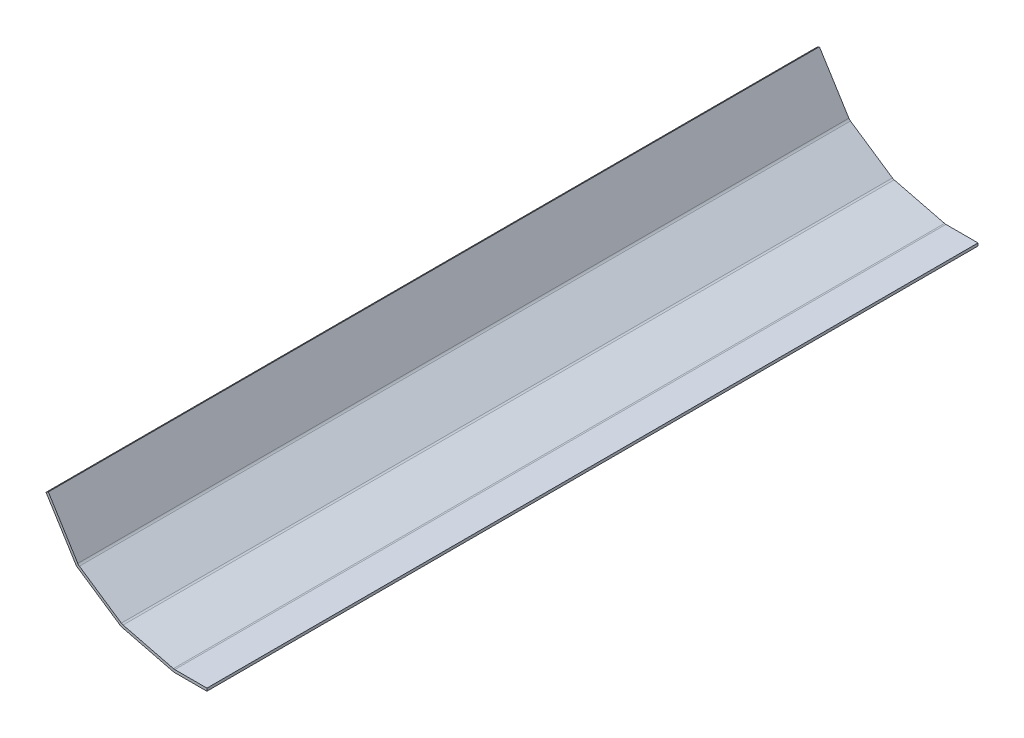
ISO-10303-21;
HEADER;
FILE_DESCRIPTION(('STEP AP214'),'2;1');
FILE_NAME('part.step','',(''),(''),'','','');
FILE_SCHEMA(('AUTOMOTIVE_DESIGN { 1 0 10303 214 1 1 1 1 }'));
ENDSEC;
DATA;
#1=APPLICATION_CONTEXT('core data for automotive mechanical design processes');
#2=APPLICATION_PROTOCOL_DEFINITION('international standard','automotive_design',2000,#1);
#3=PRODUCT_CONTEXT('',#1,'mechanical');
#4=PRODUCT('Part','Part','',(#3));
#5=PRODUCT_RELATED_PRODUCT_CATEGORY('part','',(#4));
#6=PRODUCT_DEFINITION_FORMATION('','',#4);
#7=PRODUCT_DEFINITION_CONTEXT('part definition',#1,'design');
#8=PRODUCT_DEFINITION('design','',#6,#7);
#9=PRODUCT_DEFINITION_SHAPE('','',#8);
#10=(LENGTH_UNIT() NAMED_UNIT(*) SI_UNIT(.MILLI.,.METRE.));
#11=(NAMED_UNIT(*) PLANE_ANGLE_UNIT() SI_UNIT($,.RADIAN.));
#12=(NAMED_UNIT(*) SI_UNIT($,.STERADIAN.) SOLID_ANGLE_UNIT());
#13=UNCERTAINTY_MEASURE_WITH_UNIT(LENGTH_MEASURE(1.E-05),#10,'distance_accuracy_value','');
#14=(GEOMETRIC_REPRESENTATION_CONTEXT(3) GLOBAL_UNCERTAINTY_ASSIGNED_CONTEXT((#13)) GLOBAL_UNIT_ASSIGNED_CONTEXT((#10,
#11,#12)) REPRESENTATION_CONTEXT('',''));
#15=CARTESIAN_POINT('',(0.,0.,0.));
#16=DIRECTION('',(0.,0.,1.));
#17=DIRECTION('',(1.,0.,0.));
#18=AXIS2_PLACEMENT_3D('',#15,#16,#17);
#19=CARTESIAN_POINT('',(151.999999999742,1.9999999994139,282.));
#20=DIRECTION('',(-1.,0.,0.));
#21=DIRECTION('',(0.,0.,1.));
#22=AXIS2_PLACEMENT_3D('',#19,#20,#21);
#23=PLANE('',#22);
#24=DIRECTION('',(0.,1.,0.));
#25=VECTOR('',#24,1.);
#26=CARTESIAN_POINT('',(151.999999999742,1.9999999994139,0.));
#27=LINE('',#26,#25);
#28=CARTESIAN_POINT('',(151.999999999742,1.9999999994139,0.));
#29=VERTEX_POINT('',#28);
#30=CARTESIAN_POINT('',(151.999999999742,2.9999999996182,0.));
#31=VERTEX_POINT('',#30);
#32=EDGE_CURVE('E183',#29,#31,#27,.T.);
#33=ORIENTED_EDGE('',*,*,#32,.T.);
#34=DIRECTION('',(0.,0.,-1.));
#35=VECTOR('',#34,1.);
#36=CARTESIAN_POINT('',(151.999999999742,2.9999999996182,282.));
#37=LINE('',#36,#35);
#38=CARTESIAN_POINT('',(151.999999999742,2.9999999996182,282.));
#39=VERTEX_POINT('',#38);
#40=EDGE_CURVE('E11',#39,#31,#37,.T.);
#41=ORIENTED_EDGE('',*,*,#40,.F.);
#42=DIRECTION('',(0.,1.,0.));
#43=VECTOR('',#42,1.);
#44=CARTESIAN_POINT('',(151.999999999742,1.9999999994139,282.));
#45=LINE('',#44,#43);
#46=CARTESIAN_POINT('',(151.999999999742,1.9999999994139,282.));
#47=VERTEX_POINT('',#46);
#48=EDGE_CURVE('E213',#47,#39,#45,.T.);
#49=ORIENTED_EDGE('',*,*,#48,.F.);
#50=DIRECTION('',(0.,0.,-1.));
#51=VECTOR('',#50,1.);
#52=CARTESIAN_POINT('',(151.999999999742,1.9999999994139,282.));
#53=LINE('',#52,#51);
#54=EDGE_CURVE('E179',#47,#29,#53,.T.);
#55=ORIENTED_EDGE('',*,*,#54,.T.);
#56=EDGE_LOOP('',(#33,#41,#49,#55));
#57=FACE_BOUND('',#56,.T.);
#58=ADVANCED_FACE('F39',(#57),#23,.F.);
#59=CARTESIAN_POINT('',(151.999999999742,2.9999999996182,282.));
#60=DIRECTION('',(0.,-1.,0.));
#61=DIRECTION('',(0.,0.,-1.));
#62=AXIS2_PLACEMENT_3D('',#59,#60,#61);
#63=PLANE('',#62);
#64=DIRECTION('',(-1.,0.,0.));
#65=VECTOR('',#64,1.);
#66=CARTESIAN_POINT('',(151.999999999742,2.9999999996182,0.));
#67=LINE('',#66,#65);
#68=CARTESIAN_POINT('',(140.245569121742,2.9999999996182,0.));
#69=VERTEX_POINT('',#68);
#70=EDGE_CURVE('E186',#31,#69,#67,.T.);
#71=ORIENTED_EDGE('',*,*,#70,.T.);
#72=DIRECTION('',(0.,0.,-1.));
#73=VECTOR('',#72,1.);
#74=CARTESIAN_POINT('',(140.245569121742,2.9999999996182,282.));
#75=LINE('',#74,#73);
#76=CARTESIAN_POINT('',(140.245569121742,2.9999999996182,282.));
#77=VERTEX_POINT('',#76);
#78=EDGE_CURVE('E47',#77,#69,#75,.T.);
#79=ORIENTED_EDGE('',*,*,#78,.F.);
#80=DIRECTION('',(-1.,0.,0.));
#81=VECTOR('',#80,1.);
#82=CARTESIAN_POINT('',(151.999999999742,2.9999999996182,282.));
#83=LINE('',#82,#81);
#84=EDGE_CURVE('E122',#39,#77,#83,.T.);
#85=ORIENTED_EDGE('',*,*,#84,.F.);
#86=ORIENTED_EDGE('',*,*,#40,.T.);
#87=EDGE_LOOP('',(#71,#79,#85,#86));
#88=FACE_BOUND('',#87,.T.);
#89=ADVANCED_FACE('F311',(#88),#63,.F.);
#90=CARTESIAN_POINT('',(140.245569127537,5.00000005981967,282.));
#91=DIRECTION('',(0.,0.,-1.));
#92=DIRECTION('',(-1.,0.,0.));
#93=AXIS2_PLACEMENT_3D('',#90,#91,#92);
#94=CYLINDRICAL_SURFACE('',#93,2.00000006020147);
#95=CARTESIAN_POINT('',(140.245569127537,5.00000005981967,0.));
#96=DIRECTION('',(0.,0.,-1.));
#97=DIRECTION('',(-1.,0.,0.));
#98=AXIS2_PLACEMENT_3D('',#95,#96,#97);
#99=CIRCLE('',#98,2.00000006020147);
#100=CARTESIAN_POINT('',(139.761725330742,3.05940854661819,0.));
#101=VERTEX_POINT('',#100);
#102=EDGE_CURVE('E188',#69,#101,#99,.T.);
#103=ORIENTED_EDGE('',*,*,#102,.T.);
#104=DIRECTION('',(0.,0.,-1.));
#105=VECTOR('',#104,1.);
#106=CARTESIAN_POINT('',(139.761725330742,3.05940854661819,282.));
#107=LINE('',#106,#105);
#108=CARTESIAN_POINT('',(139.761725330742,3.05940854661819,282.));
#109=VERTEX_POINT('',#108);
#110=EDGE_CURVE('E244',#109,#101,#107,.T.);
#111=ORIENTED_EDGE('',*,*,#110,.F.);
#112=CARTESIAN_POINT('',(140.245569127537,5.00000005981967,282.));
#113=DIRECTION('',(0.,0.,-1.));
#114=DIRECTION('',(-1.,0.,0.));
#115=AXIS2_PLACEMENT_3D('',#112,#113,#114);
#116=CIRCLE('',#115,2.00000006020147);
#117=EDGE_CURVE('E252',#77,#109,#116,.T.);
#118=ORIENTED_EDGE('',*,*,#117,.F.);
#119=ORIENTED_EDGE('',*,*,#78,.T.);
#120=EDGE_LOOP('',(#103,#111,#118,#119));
#121=FACE_BOUND('',#120,.T.);
#122=ADVANCED_FACE('F250',(#121),#94,.F.);
#123=CARTESIAN_POINT('',(139.761725330742,3.0594085466182,282.));
#124=DIRECTION('',(-0.241921895612643,-0.970295726272761,0.));
#125=DIRECTION('',(0.970295726272761,-0.241921895612643,0.));
#126=AXIS2_PLACEMENT_3D('',#123,#124,#125);
#127=PLANE('',#126);
#128=DIRECTION('',(-0.970295726272761,0.241921895612643,0.));
#129=VECTOR('',#128,1.);
#130=CARTESIAN_POINT('',(139.761725330742,3.0594085466182,0.));
#131=LINE('',#130,#129);
#132=CARTESIAN_POINT('',(121.342178631742,7.6519173386182,0.));
#133=VERTEX_POINT('',#132);
#134=EDGE_CURVE('E190',#101,#133,#131,.T.);
#135=ORIENTED_EDGE('',*,*,#134,.T.);
#136=DIRECTION('',(0.,0.,-1.));
#137=VECTOR('',#136,1.);
#138=CARTESIAN_POINT('',(121.342178631742,7.6519173386182,282.));
#139=LINE('',#138,#137);
#140=CARTESIAN_POINT('',(121.342178631742,7.6519173386182,282.));
#141=VERTEX_POINT('',#140);
#142=EDGE_CURVE('E241',#141,#133,#139,.T.);
#143=ORIENTED_EDGE('',*,*,#142,.F.);
#144=DIRECTION('',(-0.970295726272761,0.241921895612643,0.));
#145=VECTOR('',#144,1.);
#146=CARTESIAN_POINT('',(139.761725330742,3.0594085466182,282.));
#147=LINE('',#146,#145);
#148=EDGE_CURVE('E270',#109,#141,#147,.T.);
#149=ORIENTED_EDGE('',*,*,#148,.F.);
#150=ORIENTED_EDGE('',*,*,#110,.T.);
#151=EDGE_LOOP('',(#135,#143,#149,#150));
#152=FACE_BOUND('',#151,.T.);
#153=ADVANCED_FACE('F261',(#152),#127,.F.);
#154=CARTESIAN_POINT('',(121.826022412471,9.59250876539766,282.));
#155=DIRECTION('',(0.,0.,-1.));
#156=DIRECTION('',(-1.,0.,0.));
#157=AXIS2_PLACEMENT_3D('',#154,#155,#156);
#158=CYLINDRICAL_SURFACE('',#157,1.99999997245991);
#159=CARTESIAN_POINT('',(121.826022412471,9.59250876539766,0.));
#160=DIRECTION('',(0.,0.,-1.));
#161=DIRECTION('',(-1.,0.,0.));
#162=AXIS2_PLACEMENT_3D('',#159,#160,#161);
#163=CIRCLE('',#162,1.99999997245991);
#164=CARTESIAN_POINT('',(120.707636615742,7.9344336466182,0.));
#165=VERTEX_POINT('',#164);
#166=EDGE_CURVE('E192',#133,#165,#163,.T.);
#167=ORIENTED_EDGE('',*,*,#166,.T.);
#168=DIRECTION('',(0.,0.,-1.));
#169=VECTOR('',#168,1.);
#170=CARTESIAN_POINT('',(120.707636615742,7.9344336466182,282.));
#171=LINE('',#170,#169);
#172=CARTESIAN_POINT('',(120.707636615742,7.9344336466182,282.));
#173=VERTEX_POINT('',#172);
#174=EDGE_CURVE('E238',#173,#165,#171,.T.);
#175=ORIENTED_EDGE('',*,*,#174,.F.);
#176=CARTESIAN_POINT('',(121.826022412471,9.59250876539766,282.));
#177=DIRECTION('',(0.,0.,-1.));
#178=DIRECTION('',(-1.,0.,0.));
#179=AXIS2_PLACEMENT_3D('',#176,#177,#178);
#180=CIRCLE('',#179,1.99999997245991);
#181=EDGE_CURVE('E267',#141,#173,#180,.T.);
#182=ORIENTED_EDGE('',*,*,#181,.F.);
#183=ORIENTED_EDGE('',*,*,#142,.T.);
#184=EDGE_LOOP('',(#167,#175,#182,#183));
#185=FACE_BOUND('',#184,.T.);
#186=ADVANCED_FACE('F265',(#185),#158,.F.);
#187=CARTESIAN_POINT('',(120.707636615742,7.9344336466182,282.));
#188=DIRECTION('',(-0.559192903466935,-0.829037572557613,0.));
#189=DIRECTION('',(0.829037572557613,-0.559192903466935,0.));
#190=AXIS2_PLACEMENT_3D('',#187,#188,#189);
#191=PLANE('',#190);
#192=DIRECTION('',(-0.829037572557613,0.559192903466935,0.));
#193=VECTOR('',#192,1.);
#194=CARTESIAN_POINT('',(120.707636615742,7.9344336466182,0.));
#195=LINE('',#194,#193);
#196=CARTESIAN_POINT('',(105.352434751742,18.2916480816182,0.));
#197=VERTEX_POINT('',#196);
#198=EDGE_CURVE('E194',#165,#197,#195,.T.);
#199=ORIENTED_EDGE('',*,*,#198,.T.);
#200=DIRECTION('',(0.,0.,-1.));
#201=VECTOR('',#200,1.);
#202=CARTESIAN_POINT('',(105.352434751742,18.2916480816182,282.));
#203=LINE('',#202,#201);
#204=CARTESIAN_POINT('',(105.352434751742,18.2916480816182,282.));
#205=VERTEX_POINT('',#204);
#206=EDGE_CURVE('E235',#205,#197,#203,.T.);
#207=ORIENTED_EDGE('',*,*,#206,.F.);
#208=DIRECTION('',(-0.829037572557613,0.559192903466935,0.));
#209=VECTOR('',#208,1.);
#210=CARTESIAN_POINT('',(120.707636615742,7.9344336466182,282.));
#211=LINE('',#210,#209);
#212=EDGE_CURVE('E269',#173,#205,#211,.T.);
#213=ORIENTED_EDGE('',*,*,#212,.F.);
#214=ORIENTED_EDGE('',*,*,#174,.T.);
#215=EDGE_LOOP('',(#199,#207,#213,#214));
#216=FACE_BOUND('',#215,.T.);
#217=ADVANCED_FACE('F324',(#216),#191,.F.);
#218=CARTESIAN_POINT('',(106.470820560964,19.9497232318525,282.));
#219=DIRECTION('',(0.,0.,-1.));
#220=DIRECTION('',(-1.,0.,0.));
#221=AXIS2_PLACEMENT_3D('',#218,#219,#220);
#222=CYLINDRICAL_SURFACE('',#221,2.00000000552306);
#223=CARTESIAN_POINT('',(106.470820560964,19.9497232318525,0.));
#224=DIRECTION('',(0.,0.,-1.));
#225=DIRECTION('',(-1.,0.,0.));
#226=AXIS2_PLACEMENT_3D('',#223,#224,#225);
#227=CIRCLE('',#226,2.00000000552306);
#228=CARTESIAN_POINT('',(104.774724365742,18.8898846976182,0.));
#229=VERTEX_POINT('',#228);
#230=EDGE_CURVE('E196',#197,#229,#227,.T.);
#231=ORIENTED_EDGE('',*,*,#230,.T.);
#232=DIRECTION('',(0.,0.,-1.));
#233=VECTOR('',#232,1.);
#234=CARTESIAN_POINT('',(104.774724365742,18.8898846976182,282.));
#235=LINE('',#234,#233);
#236=CARTESIAN_POINT('',(104.774724365742,18.8898846976182,282.));
#237=VERTEX_POINT('',#236);
#238=EDGE_CURVE('E232',#237,#229,#235,.T.);
#239=ORIENTED_EDGE('',*,*,#238,.F.);
#240=CARTESIAN_POINT('',(106.470820560964,19.9497232318525,282.));
#241=DIRECTION('',(0.,0.,-1.));
#242=DIRECTION('',(-1.,0.,0.));
#243=AXIS2_PLACEMENT_3D('',#240,#241,#242);
#244=CIRCLE('',#243,2.00000000552306);
#245=EDGE_CURVE('E272',#205,#237,#244,.T.);
#246=ORIENTED_EDGE('',*,*,#245,.F.);
#247=ORIENTED_EDGE('',*,*,#206,.T.);
#248=EDGE_LOOP('',(#231,#239,#246,#247));
#249=FACE_BOUND('',#248,.T.);
#250=ADVANCED_FACE('F327',(#249),#222,.F.);
#251=CARTESIAN_POINT('',(104.774724365742,18.8898846976182,282.));
#252=DIRECTION('',(-0.848048096172864,-0.529919264206898,0.));
#253=DIRECTION('',(0.529919264206898,-0.848048096172864,0.));
#254=AXIS2_PLACEMENT_3D('',#251,#252,#253);
#255=PLANE('',#254);
#256=DIRECTION('',(-0.529919264206898,0.848048096172864,0.));
#257=VECTOR('',#256,1.);
#258=CARTESIAN_POINT('',(104.774724365742,18.8898846976182,0.));
#259=LINE('',#258,#257);
#260=CARTESIAN_POINT('',(93.9999999997425,36.1330481426182,0.));
#261=VERTEX_POINT('',#260);
#262=EDGE_CURVE('E198',#229,#261,#259,.T.);
#263=ORIENTED_EDGE('',*,*,#262,.T.);
#264=DIRECTION('',(0.,0.,-1.));
#265=VECTOR('',#264,1.);
#266=CARTESIAN_POINT('',(93.9999999997425,36.1330481426182,282.));
#267=LINE('',#266,#265);
#268=CARTESIAN_POINT('',(93.9999999997425,36.1330481426182,282.));
#269=VERTEX_POINT('',#268);
#270=EDGE_CURVE('E229',#269,#261,#267,.T.);
#271=ORIENTED_EDGE('',*,*,#270,.F.);
#272=DIRECTION('',(-0.529919264206898,0.848048096172864,0.));
#273=VECTOR('',#272,1.);
#274=CARTESIAN_POINT('',(104.774724365742,18.8898846976182,282.));
#275=LINE('',#274,#273);
#276=EDGE_CURVE('E278',#237,#269,#275,.T.);
#277=ORIENTED_EDGE('',*,*,#276,.F.);
#278=ORIENTED_EDGE('',*,*,#238,.T.);
#279=EDGE_LOOP('',(#263,#271,#277,#278));
#280=FACE_BOUND('',#279,.T.);
#281=ADVANCED_FACE('F331',(#280),#255,.F.);
#282=CARTESIAN_POINT('',(93.9999999997425,36.1330481426182,282.));
#283=DIRECTION('',(0.529919264135782,-0.848048096217303,0.));
#284=DIRECTION('',(0.848048096217303,0.529919264135782,0.));
#285=AXIS2_PLACEMENT_3D('',#282,#283,#284);
#286=PLANE('',#285);
#287=DIRECTION('',(-0.848048096217303,-0.529919264135782,0.));
#288=VECTOR('',#287,1.);
#289=CARTESIAN_POINT('',(93.9999999997425,36.1330481426182,0.));
#290=LINE('',#289,#288);
#291=CARTESIAN_POINT('',(93.1519519033519,35.6031288783742,0.));
#292=VERTEX_POINT('',#291);
#293=EDGE_CURVE('E200',#261,#292,#290,.T.);
#294=ORIENTED_EDGE('',*,*,#293,.T.);
#295=DIRECTION('',(0.,0.,-1.));
#296=VECTOR('',#295,1.);
#297=CARTESIAN_POINT('',(93.1519519033519,35.6031288783742,282.));
#298=LINE('',#297,#296);
#299=CARTESIAN_POINT('',(93.1519519033519,35.6031288783742,282.));
#300=VERTEX_POINT('',#299);
#301=EDGE_CURVE('E226',#300,#292,#298,.T.);
#302=ORIENTED_EDGE('',*,*,#301,.F.);
#303=DIRECTION('',(-0.848048096217303,-0.529919264135782,0.));
#304=VECTOR('',#303,1.);
#305=CARTESIAN_POINT('',(93.9999999997425,36.1330481426182,282.));
#306=LINE('',#305,#304);
#307=EDGE_CURVE('E280',#269,#300,#306,.T.);
#308=ORIENTED_EDGE('',*,*,#307,.F.);
#309=ORIENTED_EDGE('',*,*,#270,.T.);
#310=EDGE_LOOP('',(#294,#302,#308,#309));
#311=FACE_BOUND('',#310,.T.);
#312=ADVANCED_FACE('F335',(#311),#286,.F.);
#313=CARTESIAN_POINT('',(93.1519519033519,35.6031288783742,282.));
#314=DIRECTION('',(0.848048096172864,0.529919264206898,0.));
#315=DIRECTION('',(-0.529919264206898,0.848048096172865,0.));
#316=AXIS2_PLACEMENT_3D('',#313,#314,#315);
#317=PLANE('',#316);
#318=DIRECTION('',(0.529919264206898,-0.848048096172864,0.));
#319=VECTOR('',#318,1.);
#320=CARTESIAN_POINT('',(93.1519519033519,35.6031288783742,0.));
#321=LINE('',#320,#319);
#322=CARTESIAN_POINT('',(103.926676269352,18.3599654333741,0.));
#323=VERTEX_POINT('',#322);
#324=EDGE_CURVE('E202',#292,#323,#321,.T.);
#325=ORIENTED_EDGE('',*,*,#324,.T.);
#326=DIRECTION('',(0.,0.,-1.));
#327=VECTOR('',#326,1.);
#328=CARTESIAN_POINT('',(103.926676269352,18.3599654333741,282.));
#329=LINE('',#328,#327);
#330=CARTESIAN_POINT('',(103.926676269352,18.3599654333741,282.));
#331=VERTEX_POINT('',#330);
#332=EDGE_CURVE('E223',#331,#323,#329,.T.);
#333=ORIENTED_EDGE('',*,*,#332,.F.);
#334=DIRECTION('',(0.529919264206898,-0.848048096172864,0.));
#335=VECTOR('',#334,1.);
#336=CARTESIAN_POINT('',(93.1519519033519,35.6031288783742,282.));
#337=LINE('',#336,#335);
#338=EDGE_CURVE('E282',#300,#331,#337,.T.);
#339=ORIENTED_EDGE('',*,*,#338,.F.);
#340=ORIENTED_EDGE('',*,*,#301,.T.);
#341=EDGE_LOOP('',(#325,#333,#339,#340));
#342=FACE_BOUND('',#341,.T.);
#343=ADVANCED_FACE('F339',(#342),#317,.F.);
#344=CARTESIAN_POINT('',(106.470820560964,19.9497232318525,282.));
#345=DIRECTION('',(0.,0.,-1.));
#346=DIRECTION('',(-1.,0.,0.));
#347=AXIS2_PLACEMENT_3D('',#344,#345,#346);
#348=CYLINDRICAL_SURFACE('',#347,3.00000000572735);
#349=CARTESIAN_POINT('',(106.470820560964,19.9497232318525,0.));
#350=DIRECTION('',(0.,0.,1.));
#351=DIRECTION('',(1.,0.,0.));
#352=AXIS2_PLACEMENT_3D('',#349,#350,#351);
#353=CIRCLE('',#352,3.00000000572735);
#354=CARTESIAN_POINT('',(104.793241848,17.462610509,0.));
#355=VERTEX_POINT('',#354);
#356=EDGE_CURVE('E204',#323,#355,#353,.T.);
#357=ORIENTED_EDGE('',*,*,#356,.T.);
#358=DIRECTION('',(0.,0.,-1.));
#359=VECTOR('',#358,1.);
#360=CARTESIAN_POINT('',(104.793241848,17.462610509,282.));
#361=LINE('',#360,#359);
#362=CARTESIAN_POINT('',(104.793241848,17.462610509,282.));
#363=VERTEX_POINT('',#362);
#364=EDGE_CURVE('E220',#363,#355,#361,.T.);
#365=ORIENTED_EDGE('',*,*,#364,.F.);
#366=CARTESIAN_POINT('',(106.470820560964,19.9497232318525,282.));
#367=DIRECTION('',(0.,0.,1.));
#368=DIRECTION('',(1.,0.,0.));
#369=AXIS2_PLACEMENT_3D('',#366,#367,#368);
#370=CIRCLE('',#369,3.00000000572735);
#371=EDGE_CURVE('E284',#331,#363,#370,.T.);
#372=ORIENTED_EDGE('',*,*,#371,.F.);
#373=ORIENTED_EDGE('',*,*,#332,.T.);
#374=EDGE_LOOP('',(#357,#365,#372,#373));
#375=FACE_BOUND('',#374,.T.);
#376=ADVANCED_FACE('F343',(#375),#348,.T.);
#377=CARTESIAN_POINT('',(104.793241848,17.462610509,282.));
#378=DIRECTION('',(0.559192903466936,0.829037572557612,0.));
#379=DIRECTION('',(-0.829037572557612,0.559192903466936,0.));
#380=AXIS2_PLACEMENT_3D('',#377,#378,#379);
#381=PLANE('',#380);
#382=DIRECTION('',(0.829037572557612,-0.559192903466936,0.));
#383=VECTOR('',#382,1.);
#384=CARTESIAN_POINT('',(104.793241848,17.462610509,0.));
#385=LINE('',#384,#383);
#386=CARTESIAN_POINT('',(120.148443712,7.105396074,0.));
#387=VERTEX_POINT('',#386);
#388=EDGE_CURVE('E206',#355,#387,#385,.T.);
#389=ORIENTED_EDGE('',*,*,#388,.T.);
#390=DIRECTION('',(0.,0.,-1.));
#391=VECTOR('',#390,1.);
#392=CARTESIAN_POINT('',(120.148443712,7.105396074,282.));
#393=LINE('',#392,#391);
#394=CARTESIAN_POINT('',(120.148443712,7.105396074,282.));
#395=VERTEX_POINT('',#394);
#396=EDGE_CURVE('E217',#395,#387,#393,.T.);
#397=ORIENTED_EDGE('',*,*,#396,.F.);
#398=DIRECTION('',(0.829037572557612,-0.559192903466936,0.));
#399=VECTOR('',#398,1.);
#400=CARTESIAN_POINT('',(104.793241848,17.462610509,282.));
#401=LINE('',#400,#399);
#402=EDGE_CURVE('E286',#363,#395,#401,.T.);
#403=ORIENTED_EDGE('',*,*,#402,.F.);
#404=ORIENTED_EDGE('',*,*,#364,.T.);
#405=EDGE_LOOP('',(#389,#397,#403,#404));
#406=FACE_BOUND('',#405,.T.);
#407=ADVANCED_FACE('F292',(#406),#381,.F.);
#408=CARTESIAN_POINT('',(121.826022412471,9.59250876539766,282.));
#409=DIRECTION('',(0.,0.,-1.));
#410=DIRECTION('',(-1.,0.,0.));
#411=AXIS2_PLACEMENT_3D('',#408,#409,#410);
#412=CYLINDRICAL_SURFACE('',#411,2.99999997266422);
#413=CARTESIAN_POINT('',(121.826022412471,9.59250876539766,0.));
#414=DIRECTION('',(0.,0.,1.));
#415=DIRECTION('',(1.,0.,0.));
#416=AXIS2_PLACEMENT_3D('',#413,#414,#415);
#417=CIRCLE('',#416,2.99999997266422);
#418=CARTESIAN_POINT('',(121.100256735652,6.68162161225409,0.));
#419=VERTEX_POINT('',#418);
#420=EDGE_CURVE('E208',#387,#419,#417,.T.);
#421=ORIENTED_EDGE('',*,*,#420,.T.);
#422=DIRECTION('',(0.,0.,-1.));
#423=VECTOR('',#422,1.);
#424=CARTESIAN_POINT('',(121.100256735652,6.68162161225409,282.));
#425=LINE('',#424,#423);
#426=CARTESIAN_POINT('',(121.100256735652,6.68162161225409,282.));
#427=VERTEX_POINT('',#426);
#428=EDGE_CURVE('E174',#427,#419,#425,.T.);
#429=ORIENTED_EDGE('',*,*,#428,.F.);
#430=CARTESIAN_POINT('',(121.826022412471,9.59250876539766,282.));
#431=DIRECTION('',(0.,0.,1.));
#432=DIRECTION('',(1.,0.,0.));
#433=AXIS2_PLACEMENT_3D('',#430,#431,#432);
#434=CIRCLE('',#433,2.99999997266422);
#435=EDGE_CURVE('E165',#395,#427,#434,.T.);
#436=ORIENTED_EDGE('',*,*,#435,.F.);
#437=ORIENTED_EDGE('',*,*,#396,.T.);
#438=EDGE_LOOP('',(#421,#429,#436,#437));
#439=FACE_BOUND('',#438,.T.);
#440=ADVANCED_FACE('F296',(#439),#412,.T.);
#441=CARTESIAN_POINT('',(121.100256735652,6.68162161225409,282.));
#442=DIRECTION('',(0.241921895612643,0.970295726272761,0.));
#443=DIRECTION('',(-0.970295726272762,0.241921895612643,0.));
#444=AXIS2_PLACEMENT_3D('',#441,#442,#443);
#445=PLANE('',#444);
#446=DIRECTION('',(0.970295726272761,-0.241921895612643,0.));
#447=VECTOR('',#446,1.);
#448=CARTESIAN_POINT('',(121.100256735652,6.68162161225409,0.));
#449=LINE('',#448,#447);
#450=CARTESIAN_POINT('',(139.519803434652,2.08911282025409,0.));
#451=VERTEX_POINT('',#450);
#452=EDGE_CURVE('E173',#419,#451,#449,.T.);
#453=ORIENTED_EDGE('',*,*,#452,.T.);
#454=DIRECTION('',(0.,0.,-1.));
#455=VECTOR('',#454,1.);
#456=CARTESIAN_POINT('',(139.519803434652,2.08911282025409,282.));
#457=LINE('',#456,#455);
#458=CARTESIAN_POINT('',(139.519803434652,2.08911282025409,282.));
#459=VERTEX_POINT('',#458);
#460=EDGE_CURVE('E170',#459,#451,#457,.T.);
#461=ORIENTED_EDGE('',*,*,#460,.F.);
#462=DIRECTION('',(0.970295726272761,-0.241921895612643,0.));
#463=VECTOR('',#462,1.);
#464=CARTESIAN_POINT('',(121.100256735652,6.68162161225409,282.));
#465=LINE('',#464,#463);
#466=EDGE_CURVE('E159',#427,#459,#465,.T.);
#467=ORIENTED_EDGE('',*,*,#466,.F.);
#468=ORIENTED_EDGE('',*,*,#428,.T.);
#469=EDGE_LOOP('',(#453,#461,#467,#468));
#470=FACE_BOUND('',#469,.T.);
#471=ADVANCED_FACE('F171',(#470),#445,.F.);
#472=CARTESIAN_POINT('',(140.245569127537,5.00000005981967,282.));
#473=DIRECTION('',(0.,0.,-1.));
#474=DIRECTION('',(-1.,0.,0.));
#475=AXIS2_PLACEMENT_3D('',#472,#473,#474);
#476=CYLINDRICAL_SURFACE('',#475,3.00000006040578);
#477=CARTESIAN_POINT('',(140.245569127537,5.00000005981967,0.));
#478=DIRECTION('',(0.,0.,1.));
#479=DIRECTION('',(1.,0.,0.));
#480=AXIS2_PLACEMENT_3D('',#477,#478,#479);
#481=CIRCLE('',#480,3.00000006040578);
#482=CARTESIAN_POINT('',(140.245569121742,1.9999999994139,0.));
#483=VERTEX_POINT('',#482);
#484=EDGE_CURVE('E108',#451,#483,#481,.T.);
#485=ORIENTED_EDGE('',*,*,#484,.T.);
#486=DIRECTION('',(0.,0.,-1.));
#487=VECTOR('',#486,1.);
#488=CARTESIAN_POINT('',(140.245569121742,1.9999999994139,282.));
#489=LINE('',#488,#487);
#490=CARTESIAN_POINT('',(140.245569121742,1.9999999994139,282.));
#491=VERTEX_POINT('',#490);
#492=EDGE_CURVE('E175',#491,#483,#489,.T.);
#493=ORIENTED_EDGE('',*,*,#492,.F.);
#494=CARTESIAN_POINT('',(140.245569127537,5.00000005981967,282.));
#495=DIRECTION('',(0.,0.,1.));
#496=DIRECTION('',(1.,0.,0.));
#497=AXIS2_PLACEMENT_3D('',#494,#495,#496);
#498=CIRCLE('',#497,3.00000006040578);
#499=EDGE_CURVE('E163',#459,#491,#498,.T.);
#500=ORIENTED_EDGE('',*,*,#499,.F.);
#501=ORIENTED_EDGE('',*,*,#460,.T.);
#502=EDGE_LOOP('',(#485,#493,#500,#501));
#503=FACE_BOUND('',#502,.T.);
#504=ADVANCED_FACE('F177',(#503),#476,.T.);
#505=CARTESIAN_POINT('',(140.245569121742,1.9999999994139,282.));
#506=DIRECTION('',(0.,1.,0.));
#507=DIRECTION('',(0.,0.,1.));
#508=AXIS2_PLACEMENT_3D('',#505,#506,#507);
#509=PLANE('',#508);
#510=DIRECTION('',(1.,0.,0.));
#511=VECTOR('',#510,1.);
#512=CARTESIAN_POINT('',(140.245569121742,1.9999999994139,0.));
#513=LINE('',#512,#511);
#514=EDGE_CURVE('E114',#483,#29,#513,.T.);
#515=ORIENTED_EDGE('',*,*,#514,.T.);
#516=ORIENTED_EDGE('',*,*,#54,.F.);
#517=DIRECTION('',(1.,0.,0.));
#518=VECTOR('',#517,1.);
#519=CARTESIAN_POINT('',(140.245569121742,1.9999999994139,282.));
#520=LINE('',#519,#518);
#521=EDGE_CURVE('E55',#491,#47,#520,.T.);
#522=ORIENTED_EDGE('',*,*,#521,.F.);
#523=ORIENTED_EDGE('',*,*,#492,.T.);
#524=EDGE_LOOP('',(#515,#516,#522,#523));
#525=FACE_BOUND('',#524,.T.);
#526=ADVANCED_FACE('F300',(#525),#509,.F.);
#527=CARTESIAN_POINT('',(140.245569127537,5.00000005981967,282.));
#528=DIRECTION('',(0.,0.,-1.));
#529=DIRECTION('',(-1.,0.,0.));
#530=AXIS2_PLACEMENT_3D('',#527,#528,#529);
#531=PLANE('',#530);
#532=ORIENTED_EDGE('',*,*,#48,.T.);
#533=ORIENTED_EDGE('',*,*,#84,.T.);
#534=ORIENTED_EDGE('',*,*,#117,.T.);
#535=ORIENTED_EDGE('',*,*,#148,.T.);
#536=ORIENTED_EDGE('',*,*,#181,.T.);
#537=ORIENTED_EDGE('',*,*,#212,.T.);
#538=ORIENTED_EDGE('',*,*,#245,.T.);
#539=ORIENTED_EDGE('',*,*,#276,.T.);
#540=ORIENTED_EDGE('',*,*,#307,.T.);
#541=ORIENTED_EDGE('',*,*,#338,.T.);
#542=ORIENTED_EDGE('',*,*,#371,.T.);
#543=ORIENTED_EDGE('',*,*,#402,.T.);
#544=ORIENTED_EDGE('',*,*,#435,.T.);
#545=ORIENTED_EDGE('',*,*,#466,.T.);
#546=ORIENTED_EDGE('',*,*,#499,.T.);
#547=ORIENTED_EDGE('',*,*,#521,.T.);
#548=EDGE_LOOP('',(#532,#533,#534,#535,#536,#537,#538,#539,#540,#541,#542,#543,#544,#545,#546,#547));
#549=FACE_BOUND('',#548,.T.);
#550=ADVANCED_FACE('F161',(#549),#531,.F.);
#551=CARTESIAN_POINT('',(140.245569127537,5.00000005981967,0.));
#552=DIRECTION('',(0.,0.,-1.));
#553=DIRECTION('',(-1.,0.,0.));
#554=AXIS2_PLACEMENT_3D('',#551,#552,#553);
#555=PLANE('',#554);
#556=ORIENTED_EDGE('',*,*,#32,.F.);
#557=ORIENTED_EDGE('',*,*,#514,.F.);
#558=ORIENTED_EDGE('',*,*,#484,.F.);
#559=ORIENTED_EDGE('',*,*,#452,.F.);
#560=ORIENTED_EDGE('',*,*,#420,.F.);
#561=ORIENTED_EDGE('',*,*,#388,.F.);
#562=ORIENTED_EDGE('',*,*,#356,.F.);
#563=ORIENTED_EDGE('',*,*,#324,.F.);
#564=ORIENTED_EDGE('',*,*,#293,.F.);
#565=ORIENTED_EDGE('',*,*,#262,.F.);
#566=ORIENTED_EDGE('',*,*,#230,.F.);
#567=ORIENTED_EDGE('',*,*,#198,.F.);
#568=ORIENTED_EDGE('',*,*,#166,.F.);
#569=ORIENTED_EDGE('',*,*,#134,.F.);
#570=ORIENTED_EDGE('',*,*,#102,.F.);
#571=ORIENTED_EDGE('',*,*,#70,.F.);
#572=EDGE_LOOP('',(#556,#557,#558,#559,#560,#561,#562,#563,#564,#565,#566,#567,#568,#569,#570,#571));
#573=FACE_BOUND('',#572,.T.);
#574=ADVANCED_FACE('F256',(#573),#555,.T.);
#575=CLOSED_SHELL('',(#58,#89,#122,#153,#186,#217,#250,#281,#312,#343,#376,#407,#440,#471,#504,
#526,#550,#574));
#576=MANIFOLD_SOLID_BREP('B2',#575);
#577=ADVANCED_BREP_SHAPE_REPRESENTATION('',(#18,#576),#14);
#578=SHAPE_DEFINITION_REPRESENTATION(#9,#577);
ENDSEC;
END-ISO-10303-21;
